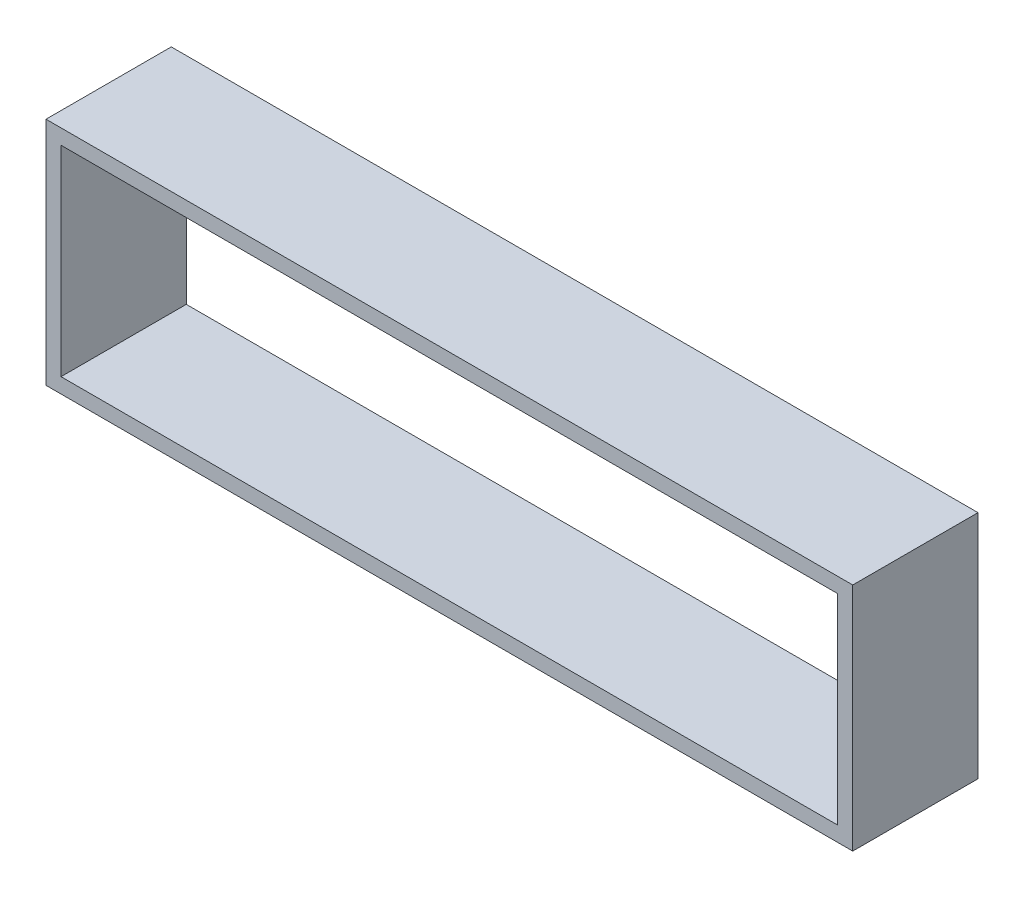
ISO-10303-21;
HEADER;
FILE_DESCRIPTION(('STEP AP214'),'2;1');
FILE_NAME('part.step','',(''),(''),'','','');
FILE_SCHEMA(('AUTOMOTIVE_DESIGN { 1 0 10303 214 1 1 1 1 }'));
ENDSEC;
DATA;
#1=APPLICATION_CONTEXT('core data for automotive mechanical design processes');
#2=APPLICATION_PROTOCOL_DEFINITION('international standard','automotive_design',2000,#1);
#3=PRODUCT_CONTEXT('',#1,'mechanical');
#4=PRODUCT('Part','Part','',(#3));
#5=PRODUCT_RELATED_PRODUCT_CATEGORY('part','',(#4));
#6=PRODUCT_DEFINITION_FORMATION('','',#4);
#7=PRODUCT_DEFINITION_CONTEXT('part definition',#1,'design');
#8=PRODUCT_DEFINITION('design','',#6,#7);
#9=PRODUCT_DEFINITION_SHAPE('','',#8);
#10=(LENGTH_UNIT() NAMED_UNIT(*) SI_UNIT(.MILLI.,.METRE.));
#11=(NAMED_UNIT(*) PLANE_ANGLE_UNIT() SI_UNIT($,.RADIAN.));
#12=(NAMED_UNIT(*) SI_UNIT($,.STERADIAN.) SOLID_ANGLE_UNIT());
#13=UNCERTAINTY_MEASURE_WITH_UNIT(LENGTH_MEASURE(1.E-05),#10,'distance_accuracy_value','');
#14=(GEOMETRIC_REPRESENTATION_CONTEXT(3) GLOBAL_UNCERTAINTY_ASSIGNED_CONTEXT((#13)) GLOBAL_UNIT_ASSIGNED_CONTEXT((#10,
#11,#12)) REPRESENTATION_CONTEXT('',''));
#15=CARTESIAN_POINT('',(0.,0.,0.));
#16=DIRECTION('',(0.,0.,1.));
#17=DIRECTION('',(1.,0.,0.));
#18=AXIS2_PLACEMENT_3D('',#15,#16,#17);
#19=CARTESIAN_POINT('',(0.,0.,25.));
#20=DIRECTION('',(0.,0.,-1.));
#21=DIRECTION('',(-1.,0.,0.));
#22=AXIS2_PLACEMENT_3D('',#19,#20,#21);
#23=PLANE('',#22);
#24=DIRECTION('',(0.,-1.,0.));
#25=VECTOR('',#24,1.);
#26=CARTESIAN_POINT('',(-3.,-3.,25.));
#27=LINE('',#26,#25);
#28=CARTESIAN_POINT('',(-3.,43.,25.));
#29=VERTEX_POINT('',#28);
#30=CARTESIAN_POINT('',(-3.,-3.,25.));
#31=VERTEX_POINT('',#30);
#32=EDGE_CURVE('E136',#29,#31,#27,.T.);
#33=ORIENTED_EDGE('',*,*,#32,.T.);
#34=DIRECTION('',(1.,0.,0.));
#35=VECTOR('',#34,1.);
#36=CARTESIAN_POINT('',(-3.,-3.,25.));
#37=LINE('',#36,#35);
#38=CARTESIAN_POINT('',(158.,-3.,25.));
#39=VERTEX_POINT('',#38);
#40=EDGE_CURVE('E139',#31,#39,#37,.T.);
#41=ORIENTED_EDGE('',*,*,#40,.T.);
#42=DIRECTION('',(0.,1.,0.));
#43=VECTOR('',#42,1.);
#44=CARTESIAN_POINT('',(158.,-3.,25.));
#45=LINE('',#44,#43);
#46=CARTESIAN_POINT('',(158.,43.,25.));
#47=VERTEX_POINT('',#46);
#48=EDGE_CURVE('E142',#39,#47,#45,.T.);
#49=ORIENTED_EDGE('',*,*,#48,.T.);
#50=DIRECTION('',(-1.,0.,0.));
#51=VECTOR('',#50,1.);
#52=CARTESIAN_POINT('',(-3.,43.,25.));
#53=LINE('',#52,#51);
#54=EDGE_CURVE('E144',#47,#29,#53,.T.);
#55=ORIENTED_EDGE('',*,*,#54,.T.);
#56=EDGE_LOOP('',(#33,#41,#49,#55));
#57=FACE_BOUND('',#56,.T.);
#58=DIRECTION('',(0.,-1.,0.));
#59=VECTOR('',#58,1.);
#60=CARTESIAN_POINT('',(0.,0.,25.));
#61=LINE('',#60,#59);
#62=CARTESIAN_POINT('',(0.,40.,25.));
#63=VERTEX_POINT('',#62);
#64=CARTESIAN_POINT('',(0.,0.,25.));
#65=VERTEX_POINT('',#64);
#66=EDGE_CURVE('E100',#63,#65,#61,.T.);
#67=ORIENTED_EDGE('',*,*,#66,.F.);
#68=DIRECTION('',(-1.,0.,0.));
#69=VECTOR('',#68,1.);
#70=CARTESIAN_POINT('',(0.,40.,25.));
#71=LINE('',#70,#69);
#72=CARTESIAN_POINT('',(155.,40.,25.));
#73=VERTEX_POINT('',#72);
#74=EDGE_CURVE('E122',#73,#63,#71,.T.);
#75=ORIENTED_EDGE('',*,*,#74,.F.);
#76=DIRECTION('',(0.,1.,0.));
#77=VECTOR('',#76,1.);
#78=CARTESIAN_POINT('',(155.,0.,25.));
#79=LINE('',#78,#77);
#80=CARTESIAN_POINT('',(155.,0.,25.));
#81=VERTEX_POINT('',#80);
#82=EDGE_CURVE('E120',#81,#73,#79,.T.);
#83=ORIENTED_EDGE('',*,*,#82,.F.);
#84=DIRECTION('',(1.,0.,0.));
#85=VECTOR('',#84,1.);
#86=CARTESIAN_POINT('',(0.,0.,25.));
#87=LINE('',#86,#85);
#88=EDGE_CURVE('E108',#65,#81,#87,.T.);
#89=ORIENTED_EDGE('',*,*,#88,.F.);
#90=EDGE_LOOP('',(#67,#75,#83,#89));
#91=FACE_BOUND('',#90,.T.);
#92=ADVANCED_FACE('F35',(#57,#91),#23,.F.);
#93=CARTESIAN_POINT('',(0.,0.,0.));
#94=DIRECTION('',(0.,0.,-1.));
#95=DIRECTION('',(-1.,0.,0.));
#96=AXIS2_PLACEMENT_3D('',#93,#94,#95);
#97=PLANE('',#96);
#98=DIRECTION('',(0.,-1.,0.));
#99=VECTOR('',#98,1.);
#100=CARTESIAN_POINT('',(-3.,-3.,0.));
#101=LINE('',#100,#99);
#102=CARTESIAN_POINT('',(-3.,43.,0.));
#103=VERTEX_POINT('',#102);
#104=CARTESIAN_POINT('',(-3.,-3.,0.));
#105=VERTEX_POINT('',#104);
#106=EDGE_CURVE('E116',#103,#105,#101,.T.);
#107=ORIENTED_EDGE('',*,*,#106,.F.);
#108=DIRECTION('',(-1.,0.,0.));
#109=VECTOR('',#108,1.);
#110=CARTESIAN_POINT('',(-3.,43.,0.));
#111=LINE('',#110,#109);
#112=CARTESIAN_POINT('',(158.,43.,0.));
#113=VERTEX_POINT('',#112);
#114=EDGE_CURVE('E140',#113,#103,#111,.T.);
#115=ORIENTED_EDGE('',*,*,#114,.F.);
#116=DIRECTION('',(0.,1.,0.));
#117=VECTOR('',#116,1.);
#118=CARTESIAN_POINT('',(158.,-3.,0.));
#119=LINE('',#118,#117);
#120=CARTESIAN_POINT('',(158.,-3.,0.));
#121=VERTEX_POINT('',#120);
#122=EDGE_CURVE('E151',#121,#113,#119,.T.);
#123=ORIENTED_EDGE('',*,*,#122,.F.);
#124=DIRECTION('',(1.,0.,0.));
#125=VECTOR('',#124,1.);
#126=CARTESIAN_POINT('',(-3.,-3.,0.));
#127=LINE('',#126,#125);
#128=EDGE_CURVE('E149',#105,#121,#127,.T.);
#129=ORIENTED_EDGE('',*,*,#128,.F.);
#130=EDGE_LOOP('',(#107,#115,#123,#129));
#131=FACE_BOUND('',#130,.T.);
#132=DIRECTION('',(-1.,0.,0.));
#133=VECTOR('',#132,1.);
#134=CARTESIAN_POINT('',(0.,40.,0.));
#135=LINE('',#134,#133);
#136=CARTESIAN_POINT('',(155.,40.,0.));
#137=VERTEX_POINT('',#136);
#138=CARTESIAN_POINT('',(0.,40.,0.));
#139=VERTEX_POINT('',#138);
#140=EDGE_CURVE('E109',#137,#139,#135,.T.);
#141=ORIENTED_EDGE('',*,*,#140,.T.);
#142=DIRECTION('',(0.,-1.,0.));
#143=VECTOR('',#142,1.);
#144=CARTESIAN_POINT('',(0.,0.,0.));
#145=LINE('',#144,#143);
#146=CARTESIAN_POINT('',(0.,0.,0.));
#147=VERTEX_POINT('',#146);
#148=EDGE_CURVE('E58',#139,#147,#145,.T.);
#149=ORIENTED_EDGE('',*,*,#148,.T.);
#150=DIRECTION('',(1.,0.,0.));
#151=VECTOR('',#150,1.);
#152=CARTESIAN_POINT('',(0.,0.,0.));
#153=LINE('',#152,#151);
#154=CARTESIAN_POINT('',(155.,0.,0.));
#155=VERTEX_POINT('',#154);
#156=EDGE_CURVE('E115',#147,#155,#153,.T.);
#157=ORIENTED_EDGE('',*,*,#156,.T.);
#158=DIRECTION('',(0.,1.,0.));
#159=VECTOR('',#158,1.);
#160=CARTESIAN_POINT('',(155.,0.,0.));
#161=LINE('',#160,#159);
#162=EDGE_CURVE('E128',#155,#137,#161,.T.);
#163=ORIENTED_EDGE('',*,*,#162,.T.);
#164=EDGE_LOOP('',(#141,#149,#157,#163));
#165=FACE_BOUND('',#164,.T.);
#166=ADVANCED_FACE('F169',(#131,#165),#97,.T.);
#167=CARTESIAN_POINT('',(-3.,-3.,25.));
#168=DIRECTION('',(1.,0.,0.));
#169=DIRECTION('',(0.,0.,-1.));
#170=AXIS2_PLACEMENT_3D('',#167,#168,#169);
#171=PLANE('',#170);
#172=ORIENTED_EDGE('',*,*,#106,.T.);
#173=DIRECTION('',(0.,0.,-1.));
#174=VECTOR('',#173,1.);
#175=CARTESIAN_POINT('',(-3.,-3.,25.));
#176=LINE('',#175,#174);
#177=EDGE_CURVE('E11',#31,#105,#176,.T.);
#178=ORIENTED_EDGE('',*,*,#177,.F.);
#179=ORIENTED_EDGE('',*,*,#32,.F.);
#180=DIRECTION('',(0.,0.,-1.));
#181=VECTOR('',#180,1.);
#182=CARTESIAN_POINT('',(-3.,43.,25.));
#183=LINE('',#182,#181);
#184=EDGE_CURVE('E146',#29,#103,#183,.T.);
#185=ORIENTED_EDGE('',*,*,#184,.T.);
#186=EDGE_LOOP('',(#172,#178,#179,#185));
#187=FACE_BOUND('',#186,.T.);
#188=ADVANCED_FACE('F37',(#187),#171,.F.);
#189=CARTESIAN_POINT('',(-3.,-3.,25.));
#190=DIRECTION('',(0.,1.,0.));
#191=DIRECTION('',(0.,0.,1.));
#192=AXIS2_PLACEMENT_3D('',#189,#190,#191);
#193=PLANE('',#192);
#194=ORIENTED_EDGE('',*,*,#128,.T.);
#195=DIRECTION('',(0.,0.,-1.));
#196=VECTOR('',#195,1.);
#197=CARTESIAN_POINT('',(158.,-3.,25.));
#198=LINE('',#197,#196);
#199=EDGE_CURVE('E43',#39,#121,#198,.T.);
#200=ORIENTED_EDGE('',*,*,#199,.F.);
#201=ORIENTED_EDGE('',*,*,#40,.F.);
#202=ORIENTED_EDGE('',*,*,#177,.T.);
#203=EDGE_LOOP('',(#194,#200,#201,#202));
#204=FACE_BOUND('',#203,.T.);
#205=ADVANCED_FACE('F179',(#204),#193,.F.);
#206=CARTESIAN_POINT('',(158.,-3.,25.));
#207=DIRECTION('',(-1.,0.,0.));
#208=DIRECTION('',(0.,0.,1.));
#209=AXIS2_PLACEMENT_3D('',#206,#207,#208);
#210=PLANE('',#209);
#211=ORIENTED_EDGE('',*,*,#122,.T.);
#212=DIRECTION('',(0.,0.,-1.));
#213=VECTOR('',#212,1.);
#214=CARTESIAN_POINT('',(158.,43.,25.));
#215=LINE('',#214,#213);
#216=EDGE_CURVE('E156',#47,#113,#215,.T.);
#217=ORIENTED_EDGE('',*,*,#216,.F.);
#218=ORIENTED_EDGE('',*,*,#48,.F.);
#219=ORIENTED_EDGE('',*,*,#199,.T.);
#220=EDGE_LOOP('',(#211,#217,#218,#219));
#221=FACE_BOUND('',#220,.T.);
#222=ADVANCED_FACE('F163',(#221),#210,.F.);
#223=CARTESIAN_POINT('',(-3.,43.,25.));
#224=DIRECTION('',(0.,-1.,0.));
#225=DIRECTION('',(0.,0.,-1.));
#226=AXIS2_PLACEMENT_3D('',#223,#224,#225);
#227=PLANE('',#226);
#228=ORIENTED_EDGE('',*,*,#114,.T.);
#229=ORIENTED_EDGE('',*,*,#184,.F.);
#230=ORIENTED_EDGE('',*,*,#54,.F.);
#231=ORIENTED_EDGE('',*,*,#216,.T.);
#232=EDGE_LOOP('',(#228,#229,#230,#231));
#233=FACE_BOUND('',#232,.T.);
#234=ADVANCED_FACE('F173',(#233),#227,.F.);
#235=CARTESIAN_POINT('',(0.,0.,25.));
#236=DIRECTION('',(1.,0.,0.));
#237=DIRECTION('',(0.,0.,-1.));
#238=AXIS2_PLACEMENT_3D('',#235,#236,#237);
#239=PLANE('',#238);
#240=ORIENTED_EDGE('',*,*,#148,.F.);
#241=DIRECTION('',(0.,0.,-1.));
#242=VECTOR('',#241,1.);
#243=CARTESIAN_POINT('',(0.,40.,25.));
#244=LINE('',#243,#242);
#245=EDGE_CURVE('E104',#63,#139,#244,.T.);
#246=ORIENTED_EDGE('',*,*,#245,.F.);
#247=ORIENTED_EDGE('',*,*,#66,.T.);
#248=DIRECTION('',(0.,0.,-1.));
#249=VECTOR('',#248,1.);
#250=CARTESIAN_POINT('',(0.,0.,25.));
#251=LINE('',#250,#249);
#252=EDGE_CURVE('E103',#65,#147,#251,.T.);
#253=ORIENTED_EDGE('',*,*,#252,.T.);
#254=EDGE_LOOP('',(#240,#246,#247,#253));
#255=FACE_BOUND('',#254,.T.);
#256=ADVANCED_FACE('F102',(#255),#239,.T.);
#257=CARTESIAN_POINT('',(0.,0.,25.));
#258=DIRECTION('',(0.,1.,0.));
#259=DIRECTION('',(0.,0.,1.));
#260=AXIS2_PLACEMENT_3D('',#257,#258,#259);
#261=PLANE('',#260);
#262=ORIENTED_EDGE('',*,*,#156,.F.);
#263=ORIENTED_EDGE('',*,*,#252,.F.);
#264=ORIENTED_EDGE('',*,*,#88,.T.);
#265=DIRECTION('',(0.,0.,-1.));
#266=VECTOR('',#265,1.);
#267=CARTESIAN_POINT('',(155.,0.,25.));
#268=LINE('',#267,#266);
#269=EDGE_CURVE('E117',#81,#155,#268,.T.);
#270=ORIENTED_EDGE('',*,*,#269,.T.);
#271=EDGE_LOOP('',(#262,#263,#264,#270));
#272=FACE_BOUND('',#271,.T.);
#273=ADVANCED_FACE('F112',(#272),#261,.T.);
#274=CARTESIAN_POINT('',(155.,0.,25.));
#275=DIRECTION('',(-1.,0.,0.));
#276=DIRECTION('',(0.,0.,1.));
#277=AXIS2_PLACEMENT_3D('',#274,#275,#276);
#278=PLANE('',#277);
#279=ORIENTED_EDGE('',*,*,#162,.F.);
#280=ORIENTED_EDGE('',*,*,#269,.F.);
#281=ORIENTED_EDGE('',*,*,#82,.T.);
#282=DIRECTION('',(0.,0.,-1.));
#283=VECTOR('',#282,1.);
#284=CARTESIAN_POINT('',(155.,40.,25.));
#285=LINE('',#284,#283);
#286=EDGE_CURVE('E50',#73,#137,#285,.T.);
#287=ORIENTED_EDGE('',*,*,#286,.T.);
#288=EDGE_LOOP('',(#279,#280,#281,#287));
#289=FACE_BOUND('',#288,.T.);
#290=ADVANCED_FACE('F202',(#289),#278,.T.);
#291=CARTESIAN_POINT('',(0.,40.,25.));
#292=DIRECTION('',(0.,-1.,0.));
#293=DIRECTION('',(1.,0.,0.));
#294=AXIS2_PLACEMENT_3D('',#291,#292,#293);
#295=PLANE('',#294);
#296=ORIENTED_EDGE('',*,*,#140,.F.);
#297=ORIENTED_EDGE('',*,*,#286,.F.);
#298=ORIENTED_EDGE('',*,*,#74,.T.);
#299=ORIENTED_EDGE('',*,*,#245,.T.);
#300=EDGE_LOOP('',(#296,#297,#298,#299));
#301=FACE_BOUND('',#300,.T.);
#302=ADVANCED_FACE('F206',(#301),#295,.T.);
#303=CLOSED_SHELL('',(#92,#166,#188,#205,#222,#234,#256,#273,#290,#302));
#304=MANIFOLD_SOLID_BREP('B2',#303);
#305=ADVANCED_BREP_SHAPE_REPRESENTATION('',(#18,#304),#14);
#306=SHAPE_DEFINITION_REPRESENTATION(#9,#305);
ENDSEC;
END-ISO-10303-21;
